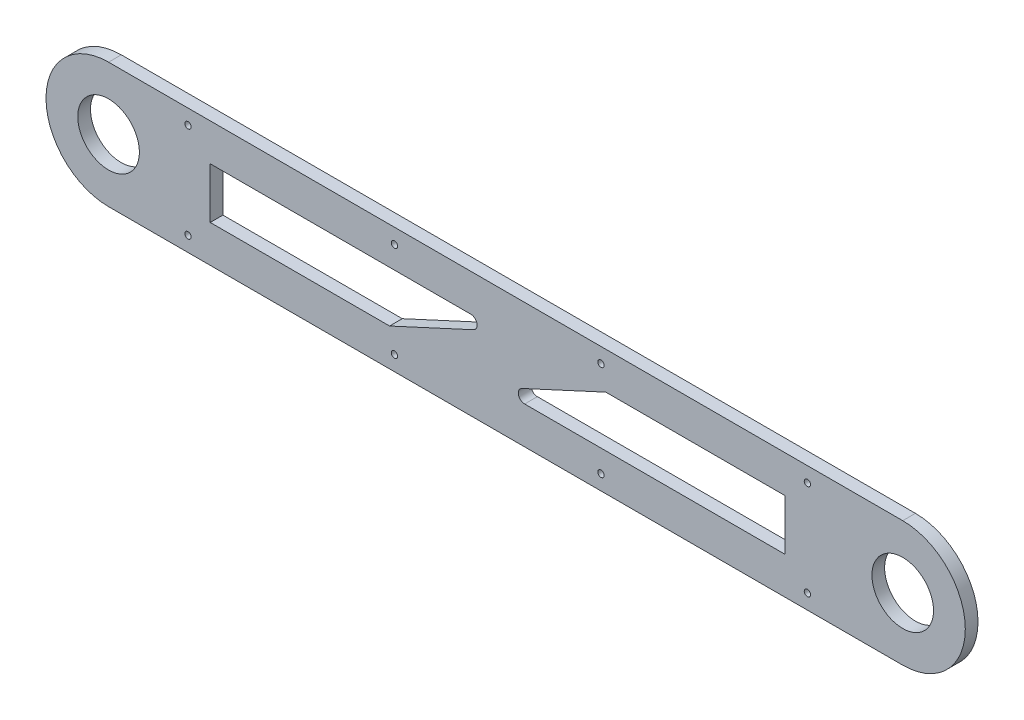
ISO-10303-21;
HEADER;
FILE_DESCRIPTION(('STEP AP214'),'2;1');
FILE_NAME('part.step','',(''),(''),'','','');
FILE_SCHEMA(('AUTOMOTIVE_DESIGN { 1 0 10303 214 1 1 1 1 }'));
ENDSEC;
DATA;
#1=APPLICATION_CONTEXT('core data for automotive mechanical design processes');
#2=APPLICATION_PROTOCOL_DEFINITION('international standard','automotive_design',2000,#1);
#3=PRODUCT_CONTEXT('',#1,'mechanical');
#4=PRODUCT('Part','Part','',(#3));
#5=PRODUCT_RELATED_PRODUCT_CATEGORY('part','',(#4));
#6=PRODUCT_DEFINITION_FORMATION('','',#4);
#7=PRODUCT_DEFINITION_CONTEXT('part definition',#1,'design');
#8=PRODUCT_DEFINITION('design','',#6,#7);
#9=PRODUCT_DEFINITION_SHAPE('','',#8);
#10=(LENGTH_UNIT() NAMED_UNIT(*) SI_UNIT(.MILLI.,.METRE.));
#11=(NAMED_UNIT(*) PLANE_ANGLE_UNIT() SI_UNIT($,.RADIAN.));
#12=(NAMED_UNIT(*) SI_UNIT($,.STERADIAN.) SOLID_ANGLE_UNIT());
#13=UNCERTAINTY_MEASURE_WITH_UNIT(LENGTH_MEASURE(1.E-05),#10,'distance_accuracy_value','');
#14=(GEOMETRIC_REPRESENTATION_CONTEXT(3) GLOBAL_UNCERTAINTY_ASSIGNED_CONTEXT((#13)) GLOBAL_UNIT_ASSIGNED_CONTEXT((#10,
#11,#12)) REPRESENTATION_CONTEXT('',''));
#15=CARTESIAN_POINT('',(0.,0.,0.));
#16=DIRECTION('',(0.,0.,1.));
#17=DIRECTION('',(1.,0.,0.));
#18=AXIS2_PLACEMENT_3D('',#15,#16,#17);
#19=CARTESIAN_POINT('',(0.,0.,4.));
#20=DIRECTION('',(0.,0.,1.));
#21=DIRECTION('',(1.,0.,0.));
#22=AXIS2_PLACEMENT_3D('',#19,#20,#21);
#23=PLANE('',#22);
#24=CARTESIAN_POINT('',(130.976731594915,-6.,4.));
#25=DIRECTION('',(0.,0.,1.));
#26=DIRECTION('',(-1.,0.,0.));
#27=AXIS2_PLACEMENT_3D('',#24,#25,#26);
#28=CIRCLE('',#27,2.);
#29=CARTESIAN_POINT('',(130.138615239991,-4.18408123099903,4.));
#30=VERTEX_POINT('',#29);
#31=CARTESIAN_POINT('',(130.976731594915,-8.,4.));
#32=VERTEX_POINT('',#31);
#33=EDGE_CURVE('E54',#30,#32,#28,.T.);
#34=ORIENTED_EDGE('',*,*,#33,.F.);
#35=DIRECTION('',(-0.907959384500451,-0.419058177461749,0.));
#36=VECTOR('',#35,1.);
#37=CARTESIAN_POINT('',(156.537457907156,8.,4.));
#38=LINE('',#37,#36);
#39=CARTESIAN_POINT('',(156.537457907156,8.,4.));
#40=VERTEX_POINT('',#39);
#41=EDGE_CURVE('E170',#40,#30,#38,.T.);
#42=ORIENTED_EDGE('',*,*,#41,.F.);
#43=DIRECTION('',(-1.,0.,0.));
#44=VECTOR('',#43,1.);
#45=CARTESIAN_POINT('',(156.537457907156,8.,4.));
#46=LINE('',#45,#44);
#47=CARTESIAN_POINT('',(213.,8.,4.));
#48=VERTEX_POINT('',#47);
#49=EDGE_CURVE('E166',#48,#40,#46,.T.);
#50=ORIENTED_EDGE('',*,*,#49,.F.);
#51=DIRECTION('',(0.,1.,0.));
#52=VECTOR('',#51,1.);
#53=CARTESIAN_POINT('',(213.,8.,4.));
#54=LINE('',#53,#52);
#55=CARTESIAN_POINT('',(213.,-8.,4.));
#56=VERTEX_POINT('',#55);
#57=EDGE_CURVE('E147',#56,#48,#54,.T.);
#58=ORIENTED_EDGE('',*,*,#57,.F.);
#59=DIRECTION('',(1.,0.,0.));
#60=VECTOR('',#59,1.);
#61=CARTESIAN_POINT('',(213.,-8.,4.));
#62=LINE('',#61,#60);
#63=EDGE_CURVE('E158',#32,#56,#62,.T.);
#64=ORIENTED_EDGE('',*,*,#63,.F.);
#65=EDGE_LOOP('',(#34,#42,#50,#58,#64));
#66=FACE_BOUND('',#65,.T.);
#67=DIRECTION('',(0.,-1.,0.));
#68=VECTOR('',#67,1.);
#69=CARTESIAN_POINT('',(32.0000000000003,-8.,4.));
#70=LINE('',#69,#68);
#71=CARTESIAN_POINT('',(32.0000000000003,8.,4.));
#72=VERTEX_POINT('',#71);
#73=CARTESIAN_POINT('',(32.0000000000003,-8.,4.));
#74=VERTEX_POINT('',#73);
#75=EDGE_CURVE('E62',#72,#74,#70,.T.);
#76=ORIENTED_EDGE('',*,*,#75,.F.);
#77=DIRECTION('',(-1.,0.,0.));
#78=VECTOR('',#77,1.);
#79=CARTESIAN_POINT('',(32.0000000000003,8.,4.));
#80=LINE('',#79,#78);
#81=CARTESIAN_POINT('',(114.023268405086,8.,4.));
#82=VERTEX_POINT('',#81);
#83=EDGE_CURVE('E202',#82,#72,#80,.T.);
#84=ORIENTED_EDGE('',*,*,#83,.F.);
#85=CARTESIAN_POINT('',(114.023268405086,6.,4.));
#86=DIRECTION('',(0.,0.,1.));
#87=DIRECTION('',(1.,0.,0.));
#88=AXIS2_PLACEMENT_3D('',#85,#86,#87);
#89=CIRCLE('',#88,2.);
#90=CARTESIAN_POINT('',(114.861384760009,4.18408123099904,4.));
#91=VERTEX_POINT('',#90);
#92=EDGE_CURVE('E198',#91,#82,#89,.T.);
#93=ORIENTED_EDGE('',*,*,#92,.F.);
#94=DIRECTION('',(0.907959384500451,0.419058177461749,0.));
#95=VECTOR('',#94,1.);
#96=CARTESIAN_POINT('',(114.861384760009,4.18408123099903,4.));
#97=LINE('',#96,#95);
#98=CARTESIAN_POINT('',(88.4625420928446,-8.,4.));
#99=VERTEX_POINT('',#98);
#100=EDGE_CURVE('E194',#99,#91,#97,.T.);
#101=ORIENTED_EDGE('',*,*,#100,.F.);
#102=DIRECTION('',(1.,0.,0.));
#103=VECTOR('',#102,1.);
#104=CARTESIAN_POINT('',(88.4625420928446,-8.,4.));
#105=LINE('',#104,#103);
#106=EDGE_CURVE('E190',#74,#99,#105,.T.);
#107=ORIENTED_EDGE('',*,*,#106,.F.);
#108=EDGE_LOOP('',(#76,#84,#93,#101,#107));
#109=FACE_BOUND('',#108,.T.);
#110=CARTESIAN_POINT('',(90.0000000000003,-15.,4.));
#111=DIRECTION('',(0.,0.,1.));
#112=DIRECTION('',(1.,0.,0.));
#113=AXIS2_PLACEMENT_3D('',#110,#111,#112);
#114=CIRCLE('',#113,0.999999999999998);
#115=CARTESIAN_POINT('',(91.0000000000003,-15.,4.));
#116=VERTEX_POINT('',#115);
#117=EDGE_CURVE('E225',#116,#116,#114,.T.);
#118=ORIENTED_EDGE('',*,*,#117,.F.);
#119=EDGE_LOOP('',(#118));
#120=FACE_BOUND('',#119,.T.);
#121=CARTESIAN_POINT('',(220.,15.,4.));
#122=DIRECTION('',(0.,0.,1.));
#123=DIRECTION('',(1.,0.,0.));
#124=AXIS2_PLACEMENT_3D('',#121,#122,#123);
#125=CIRCLE('',#124,0.999999999999998);
#126=CARTESIAN_POINT('',(221.,15.,4.));
#127=VERTEX_POINT('',#126);
#128=EDGE_CURVE('E233',#127,#127,#125,.T.);
#129=ORIENTED_EDGE('',*,*,#128,.F.);
#130=EDGE_LOOP('',(#129));
#131=FACE_BOUND('',#130,.T.);
#132=CARTESIAN_POINT('',(155.,15.,4.));
#133=DIRECTION('',(0.,0.,1.));
#134=DIRECTION('',(1.,0.,0.));
#135=AXIS2_PLACEMENT_3D('',#132,#133,#134);
#136=CIRCLE('',#135,0.999999999999998);
#137=CARTESIAN_POINT('',(156.,15.,4.));
#138=VERTEX_POINT('',#137);
#139=EDGE_CURVE('E237',#138,#138,#136,.T.);
#140=ORIENTED_EDGE('',*,*,#139,.F.);
#141=EDGE_LOOP('',(#140));
#142=FACE_BOUND('',#141,.T.);
#143=CARTESIAN_POINT('',(90.,15.,4.));
#144=DIRECTION('',(0.,0.,1.));
#145=DIRECTION('',(1.,0.,0.));
#146=AXIS2_PLACEMENT_3D('',#143,#144,#145);
#147=CIRCLE('',#146,1.00000000000001);
#148=CARTESIAN_POINT('',(91.,15.,4.));
#149=VERTEX_POINT('',#148);
#150=EDGE_CURVE('E241',#149,#149,#147,.T.);
#151=ORIENTED_EDGE('',*,*,#150,.F.);
#152=EDGE_LOOP('',(#151));
#153=FACE_BOUND('',#152,.T.);
#154=CARTESIAN_POINT('',(155.,-15.,4.));
#155=DIRECTION('',(0.,0.,1.));
#156=DIRECTION('',(1.,0.,0.));
#157=AXIS2_PLACEMENT_3D('',#154,#155,#156);
#158=CIRCLE('',#157,0.999999999999998);
#159=CARTESIAN_POINT('',(156.,-15.,4.));
#160=VERTEX_POINT('',#159);
#161=EDGE_CURVE('E221',#160,#160,#158,.T.);
#162=ORIENTED_EDGE('',*,*,#161,.F.);
#163=EDGE_LOOP('',(#162));
#164=FACE_BOUND('',#163,.T.);
#165=CARTESIAN_POINT('',(220.,-15.,4.));
#166=DIRECTION('',(0.,0.,1.));
#167=DIRECTION('',(1.,0.,0.));
#168=AXIS2_PLACEMENT_3D('',#165,#166,#167);
#169=CIRCLE('',#168,0.999999999999998);
#170=CARTESIAN_POINT('',(221.,-15.,4.));
#171=VERTEX_POINT('',#170);
#172=EDGE_CURVE('E226',#171,#171,#169,.T.);
#173=ORIENTED_EDGE('',*,*,#172,.F.);
#174=EDGE_LOOP('',(#173));
#175=FACE_BOUND('',#174,.T.);
#176=CARTESIAN_POINT('',(25.0000000000003,-15.,4.));
#177=DIRECTION('',(0.,0.,1.));
#178=DIRECTION('',(1.,0.,0.));
#179=AXIS2_PLACEMENT_3D('',#176,#177,#178);
#180=CIRCLE('',#179,1.);
#181=CARTESIAN_POINT('',(26.0000000000003,-15.,4.));
#182=VERTEX_POINT('',#181);
#183=EDGE_CURVE('E180',#182,#182,#180,.T.);
#184=ORIENTED_EDGE('',*,*,#183,.F.);
#185=EDGE_LOOP('',(#184));
#186=FACE_BOUND('',#185,.T.);
#187=CARTESIAN_POINT('',(25.,15.,4.));
#188=DIRECTION('',(0.,0.,1.));
#189=DIRECTION('',(1.,0.,0.));
#190=AXIS2_PLACEMENT_3D('',#187,#188,#189);
#191=CIRCLE('',#190,1.);
#192=CARTESIAN_POINT('',(26.,15.,4.));
#193=VERTEX_POINT('',#192);
#194=EDGE_CURVE('E245',#193,#193,#191,.T.);
#195=ORIENTED_EDGE('',*,*,#194,.F.);
#196=EDGE_LOOP('',(#195));
#197=FACE_BOUND('',#196,.T.);
#198=CARTESIAN_POINT('',(0.,0.,4.));
#199=DIRECTION('',(0.,0.,1.));
#200=DIRECTION('',(1.,0.,0.));
#201=AXIS2_PLACEMENT_3D('',#198,#199,#200);
#202=CIRCLE('',#201,9.7);
#203=CARTESIAN_POINT('',(9.7,0.,4.));
#204=VERTEX_POINT('',#203);
#205=EDGE_CURVE('E263',#204,#204,#202,.T.);
#206=ORIENTED_EDGE('',*,*,#205,.F.);
#207=EDGE_LOOP('',(#206));
#208=FACE_BOUND('',#207,.T.);
#209=CARTESIAN_POINT('',(0.,0.,4.));
#210=DIRECTION('',(0.,0.,1.));
#211=DIRECTION('',(1.,0.,0.));
#212=AXIS2_PLACEMENT_3D('',#209,#210,#211);
#213=CIRCLE('',#212,19.7);
#214=CARTESIAN_POINT('',(0.,19.7,4.));
#215=VERTEX_POINT('',#214);
#216=CARTESIAN_POINT('',(0.,-19.7,4.));
#217=VERTEX_POINT('',#216);
#218=EDGE_CURVE('E271',#215,#217,#213,.T.);
#219=ORIENTED_EDGE('',*,*,#218,.T.);
#220=DIRECTION('',(1.,0.,0.));
#221=VECTOR('',#220,1.);
#222=CARTESIAN_POINT('',(0.,-19.7,4.));
#223=LINE('',#222,#221);
#224=CARTESIAN_POINT('',(250.,-19.7,4.));
#225=VERTEX_POINT('',#224);
#226=EDGE_CURVE('E275',#217,#225,#223,.T.);
#227=ORIENTED_EDGE('',*,*,#226,.T.);
#228=CARTESIAN_POINT('',(250.,0.,4.));
#229=DIRECTION('',(0.,0.,1.));
#230=DIRECTION('',(-1.,0.,0.));
#231=AXIS2_PLACEMENT_3D('',#228,#229,#230);
#232=CIRCLE('',#231,19.7);
#233=CARTESIAN_POINT('',(250.,19.7,4.));
#234=VERTEX_POINT('',#233);
#235=EDGE_CURVE('E279',#225,#234,#232,.T.);
#236=ORIENTED_EDGE('',*,*,#235,.T.);
#237=DIRECTION('',(-1.,0.,0.));
#238=VECTOR('',#237,1.);
#239=CARTESIAN_POINT('',(0.,19.7,4.));
#240=LINE('',#239,#238);
#241=EDGE_CURVE('E282',#234,#215,#240,.T.);
#242=ORIENTED_EDGE('',*,*,#241,.T.);
#243=EDGE_LOOP('',(#219,#227,#236,#242));
#244=FACE_BOUND('',#243,.T.);
#245=CARTESIAN_POINT('',(250.,0.,4.));
#246=DIRECTION('',(0.,0.,1.));
#247=DIRECTION('',(1.,0.,0.));
#248=AXIS2_PLACEMENT_3D('',#245,#246,#247);
#249=CIRCLE('',#248,9.7);
#250=CARTESIAN_POINT('',(259.7,0.,4.));
#251=VERTEX_POINT('',#250);
#252=EDGE_CURVE('E253',#251,#251,#249,.T.);
#253=ORIENTED_EDGE('',*,*,#252,.F.);
#254=EDGE_LOOP('',(#253));
#255=FACE_BOUND('',#254,.T.);
#256=ADVANCED_FACE('F38',(#66,#109,#120,#131,#142,#153,#164,#175,#186,#197,#208,#244,#255),#23,.T.);
#257=CARTESIAN_POINT('',(0.,0.,0.));
#258=DIRECTION('',(0.,0.,1.));
#259=DIRECTION('',(1.,0.,0.));
#260=AXIS2_PLACEMENT_3D('',#257,#258,#259);
#261=PLANE('',#260);
#262=DIRECTION('',(-0.907959384500451,-0.419058177461749,0.));
#263=VECTOR('',#262,1.);
#264=CARTESIAN_POINT('',(24.4456023641837,-52.9654717890643,0.));
#265=LINE('',#264,#263);
#266=CARTESIAN_POINT('',(156.537457907156,8.,0.));
#267=VERTEX_POINT('',#266);
#268=CARTESIAN_POINT('',(130.138615239991,-4.18408123099903,0.));
#269=VERTEX_POINT('',#268);
#270=EDGE_CURVE('E47',#267,#269,#265,.T.);
#271=ORIENTED_EDGE('',*,*,#270,.T.);
#272=CARTESIAN_POINT('',(130.976731594915,-6.,0.));
#273=DIRECTION('',(0.,0.,1.));
#274=DIRECTION('',(1.,0.,0.));
#275=AXIS2_PLACEMENT_3D('',#272,#273,#274);
#276=CIRCLE('',#275,2.);
#277=CARTESIAN_POINT('',(130.976731594915,-8.,0.));
#278=VERTEX_POINT('',#277);
#279=EDGE_CURVE('E11',#269,#278,#276,.T.);
#280=ORIENTED_EDGE('',*,*,#279,.T.);
#281=DIRECTION('',(1.,0.,0.));
#282=VECTOR('',#281,1.);
#283=CARTESIAN_POINT('',(0.,-8.,0.));
#284=LINE('',#283,#282);
#285=CARTESIAN_POINT('',(213.,-8.,0.));
#286=VERTEX_POINT('',#285);
#287=EDGE_CURVE('E362',#278,#286,#284,.T.);
#288=ORIENTED_EDGE('',*,*,#287,.T.);
#289=DIRECTION('',(0.,1.,0.));
#290=VECTOR('',#289,1.);
#291=CARTESIAN_POINT('',(213.,0.,0.));
#292=LINE('',#291,#290);
#293=CARTESIAN_POINT('',(213.,8.,0.));
#294=VERTEX_POINT('',#293);
#295=EDGE_CURVE('E150',#286,#294,#292,.T.);
#296=ORIENTED_EDGE('',*,*,#295,.T.);
#297=DIRECTION('',(-1.,0.,0.));
#298=VECTOR('',#297,1.);
#299=CARTESIAN_POINT('',(0.,8.,0.));
#300=LINE('',#299,#298);
#301=EDGE_CURVE('E367',#294,#267,#300,.T.);
#302=ORIENTED_EDGE('',*,*,#301,.T.);
#303=EDGE_LOOP('',(#271,#280,#288,#296,#302));
#304=FACE_BOUND('',#303,.T.);
#305=DIRECTION('',(-1.,0.,0.));
#306=VECTOR('',#305,1.);
#307=CARTESIAN_POINT('',(0.,8.,0.));
#308=LINE('',#307,#306);
#309=CARTESIAN_POINT('',(114.023268405086,8.,0.));
#310=VERTEX_POINT('',#309);
#311=CARTESIAN_POINT('',(32.0000000000003,8.,0.));
#312=VERTEX_POINT('',#311);
#313=EDGE_CURVE('E354',#310,#312,#308,.T.);
#314=ORIENTED_EDGE('',*,*,#313,.T.);
#315=DIRECTION('',(0.,-1.,0.));
#316=VECTOR('',#315,1.);
#317=CARTESIAN_POINT('',(32.0000000000003,0.,0.));
#318=LINE('',#317,#316);
#319=CARTESIAN_POINT('',(32.0000000000003,-8.,0.));
#320=VERTEX_POINT('',#319);
#321=EDGE_CURVE('E358',#312,#320,#318,.T.);
#322=ORIENTED_EDGE('',*,*,#321,.T.);
#323=DIRECTION('',(1.,0.,0.));
#324=VECTOR('',#323,1.);
#325=CARTESIAN_POINT('',(0.,-8.,0.));
#326=LINE('',#325,#324);
#327=CARTESIAN_POINT('',(88.4625420928446,-8.,0.));
#328=VERTEX_POINT('',#327);
#329=EDGE_CURVE('E312',#320,#328,#326,.T.);
#330=ORIENTED_EDGE('',*,*,#329,.T.);
#331=DIRECTION('',(0.907959384500451,0.419058177461749,0.));
#332=VECTOR('',#331,1.);
#333=CARTESIAN_POINT('',(18.5787878797192,-40.254040406058,0.));
#334=LINE('',#333,#332);
#335=CARTESIAN_POINT('',(114.861384760009,4.18408123099904,0.));
#336=VERTEX_POINT('',#335);
#337=EDGE_CURVE('E346',#328,#336,#334,.T.);
#338=ORIENTED_EDGE('',*,*,#337,.T.);
#339=CARTESIAN_POINT('',(114.023268405086,6.,0.));
#340=DIRECTION('',(0.,0.,1.));
#341=DIRECTION('',(1.,0.,0.));
#342=AXIS2_PLACEMENT_3D('',#339,#340,#341);
#343=CIRCLE('',#342,2.);
#344=EDGE_CURVE('E350',#336,#310,#343,.T.);
#345=ORIENTED_EDGE('',*,*,#344,.T.);
#346=EDGE_LOOP('',(#314,#322,#330,#338,#345));
#347=FACE_BOUND('',#346,.T.);
#348=CARTESIAN_POINT('',(90.0000000000003,-15.,0.));
#349=DIRECTION('',(0.,0.,1.));
#350=DIRECTION('',(1.,0.,0.));
#351=AXIS2_PLACEMENT_3D('',#348,#349,#350);
#352=CIRCLE('',#351,0.999999999999998);
#353=CARTESIAN_POINT('',(91.0000000000003,-15.,0.));
#354=VERTEX_POINT('',#353);
#355=EDGE_CURVE('E262',#354,#354,#352,.T.);
#356=ORIENTED_EDGE('',*,*,#355,.T.);
#357=EDGE_LOOP('',(#356));
#358=FACE_BOUND('',#357,.T.);
#359=CARTESIAN_POINT('',(220.,15.,0.));
#360=DIRECTION('',(0.,0.,1.));
#361=DIRECTION('',(1.,0.,0.));
#362=AXIS2_PLACEMENT_3D('',#359,#360,#361);
#363=CIRCLE('',#362,0.999999999999998);
#364=CARTESIAN_POINT('',(221.,15.,0.));
#365=VERTEX_POINT('',#364);
#366=EDGE_CURVE('E336',#365,#365,#363,.T.);
#367=ORIENTED_EDGE('',*,*,#366,.T.);
#368=EDGE_LOOP('',(#367));
#369=FACE_BOUND('',#368,.T.);
#370=CARTESIAN_POINT('',(155.,15.,0.));
#371=DIRECTION('',(0.,0.,1.));
#372=DIRECTION('',(1.,0.,0.));
#373=AXIS2_PLACEMENT_3D('',#370,#371,#372);
#374=CIRCLE('',#373,0.999999999999998);
#375=CARTESIAN_POINT('',(156.,15.,0.));
#376=VERTEX_POINT('',#375);
#377=EDGE_CURVE('E332',#376,#376,#374,.T.);
#378=ORIENTED_EDGE('',*,*,#377,.T.);
#379=EDGE_LOOP('',(#378));
#380=FACE_BOUND('',#379,.T.);
#381=CARTESIAN_POINT('',(90.,15.,0.));
#382=DIRECTION('',(0.,0.,1.));
#383=DIRECTION('',(1.,0.,0.));
#384=AXIS2_PLACEMENT_3D('',#381,#382,#383);
#385=CIRCLE('',#384,1.00000000000001);
#386=CARTESIAN_POINT('',(91.,15.,0.));
#387=VERTEX_POINT('',#386);
#388=EDGE_CURVE('E328',#387,#387,#385,.T.);
#389=ORIENTED_EDGE('',*,*,#388,.T.);
#390=EDGE_LOOP('',(#389));
#391=FACE_BOUND('',#390,.T.);
#392=CARTESIAN_POINT('',(155.,-15.,0.));
#393=DIRECTION('',(0.,0.,1.));
#394=DIRECTION('',(1.,0.,0.));
#395=AXIS2_PLACEMENT_3D('',#392,#393,#394);
#396=CIRCLE('',#395,0.999999999999998);
#397=CARTESIAN_POINT('',(156.,-15.,0.));
#398=VERTEX_POINT('',#397);
#399=EDGE_CURVE('E324',#398,#398,#396,.T.);
#400=ORIENTED_EDGE('',*,*,#399,.T.);
#401=EDGE_LOOP('',(#400));
#402=FACE_BOUND('',#401,.T.);
#403=CARTESIAN_POINT('',(220.,-15.,0.));
#404=DIRECTION('',(0.,0.,1.));
#405=DIRECTION('',(1.,0.,0.));
#406=AXIS2_PLACEMENT_3D('',#403,#404,#405);
#407=CIRCLE('',#406,0.999999999999998);
#408=CARTESIAN_POINT('',(221.,-15.,0.));
#409=VERTEX_POINT('',#408);
#410=EDGE_CURVE('E320',#409,#409,#407,.T.);
#411=ORIENTED_EDGE('',*,*,#410,.T.);
#412=EDGE_LOOP('',(#411));
#413=FACE_BOUND('',#412,.T.);
#414=CARTESIAN_POINT('',(25.0000000000003,-15.,0.));
#415=DIRECTION('',(0.,0.,1.));
#416=DIRECTION('',(1.,0.,0.));
#417=AXIS2_PLACEMENT_3D('',#414,#415,#416);
#418=CIRCLE('',#417,1.);
#419=CARTESIAN_POINT('',(26.0000000000003,-15.,0.));
#420=VERTEX_POINT('',#419);
#421=EDGE_CURVE('E316',#420,#420,#418,.T.);
#422=ORIENTED_EDGE('',*,*,#421,.T.);
#423=EDGE_LOOP('',(#422));
#424=FACE_BOUND('',#423,.T.);
#425=CARTESIAN_POINT('',(25.,15.,0.));
#426=DIRECTION('',(0.,0.,1.));
#427=DIRECTION('',(1.,0.,0.));
#428=AXIS2_PLACEMENT_3D('',#425,#426,#427);
#429=CIRCLE('',#428,1.);
#430=CARTESIAN_POINT('',(26.,15.,0.));
#431=VERTEX_POINT('',#430);
#432=EDGE_CURVE('E252',#431,#431,#429,.T.);
#433=ORIENTED_EDGE('',*,*,#432,.T.);
#434=EDGE_LOOP('',(#433));
#435=FACE_BOUND('',#434,.T.);
#436=CARTESIAN_POINT('',(0.,0.,0.));
#437=DIRECTION('',(0.,0.,1.));
#438=DIRECTION('',(1.,0.,0.));
#439=AXIS2_PLACEMENT_3D('',#436,#437,#438);
#440=CIRCLE('',#439,19.7);
#441=CARTESIAN_POINT('',(0.,19.7,0.));
#442=VERTEX_POINT('',#441);
#443=CARTESIAN_POINT('',(0.,-19.7,0.));
#444=VERTEX_POINT('',#443);
#445=EDGE_CURVE('E267',#442,#444,#440,.T.);
#446=ORIENTED_EDGE('',*,*,#445,.F.);
#447=DIRECTION('',(-1.,0.,0.));
#448=VECTOR('',#447,1.);
#449=CARTESIAN_POINT('',(0.,19.7,0.));
#450=LINE('',#449,#448);
#451=CARTESIAN_POINT('',(250.,19.7,0.));
#452=VERTEX_POINT('',#451);
#453=EDGE_CURVE('E276',#452,#442,#450,.T.);
#454=ORIENTED_EDGE('',*,*,#453,.F.);
#455=CARTESIAN_POINT('',(250.,0.,0.));
#456=DIRECTION('',(0.,0.,1.));
#457=DIRECTION('',(-1.,0.,0.));
#458=AXIS2_PLACEMENT_3D('',#455,#456,#457);
#459=CIRCLE('',#458,19.7);
#460=CARTESIAN_POINT('',(250.,-19.7,0.));
#461=VERTEX_POINT('',#460);
#462=EDGE_CURVE('E292',#461,#452,#459,.T.);
#463=ORIENTED_EDGE('',*,*,#462,.F.);
#464=DIRECTION('',(1.,0.,0.));
#465=VECTOR('',#464,1.);
#466=CARTESIAN_POINT('',(0.,-19.7,0.));
#467=LINE('',#466,#465);
#468=EDGE_CURVE('E289',#444,#461,#467,.T.);
#469=ORIENTED_EDGE('',*,*,#468,.F.);
#470=EDGE_LOOP('',(#446,#454,#463,#469));
#471=FACE_BOUND('',#470,.T.);
#472=CARTESIAN_POINT('',(0.,0.,0.));
#473=DIRECTION('',(0.,0.,1.));
#474=DIRECTION('',(1.,0.,0.));
#475=AXIS2_PLACEMENT_3D('',#472,#473,#474);
#476=CIRCLE('',#475,9.7);
#477=CARTESIAN_POINT('',(9.7,0.,0.));
#478=VERTEX_POINT('',#477);
#479=EDGE_CURVE('E257',#478,#478,#476,.T.);
#480=ORIENTED_EDGE('',*,*,#479,.T.);
#481=EDGE_LOOP('',(#480));
#482=FACE_BOUND('',#481,.T.);
#483=CARTESIAN_POINT('',(250.,0.,0.));
#484=DIRECTION('',(0.,0.,1.));
#485=DIRECTION('',(1.,0.,0.));
#486=AXIS2_PLACEMENT_3D('',#483,#484,#485);
#487=CIRCLE('',#486,9.7);
#488=CARTESIAN_POINT('',(259.7,0.,0.));
#489=VERTEX_POINT('',#488);
#490=EDGE_CURVE('E258',#489,#489,#487,.T.);
#491=ORIENTED_EDGE('',*,*,#490,.T.);
#492=EDGE_LOOP('',(#491));
#493=FACE_BOUND('',#492,.T.);
#494=ADVANCED_FACE('F373',(#304,#347,#358,#369,#380,#391,#402,#413,#424,#435,#471,#482,#493),
#261,.F.);
#495=CARTESIAN_POINT('',(0.,0.,4.));
#496=DIRECTION('',(0.,0.,-1.));
#497=DIRECTION('',(-1.,0.,0.));
#498=AXIS2_PLACEMENT_3D('',#495,#496,#497);
#499=CYLINDRICAL_SURFACE('',#498,19.7);
#500=ORIENTED_EDGE('',*,*,#445,.T.);
#501=DIRECTION('',(0.,0.,-1.));
#502=VECTOR('',#501,1.);
#503=CARTESIAN_POINT('',(0.,-19.7,4.));
#504=LINE('',#503,#502);
#505=EDGE_CURVE('E308',#217,#444,#504,.T.);
#506=ORIENTED_EDGE('',*,*,#505,.F.);
#507=ORIENTED_EDGE('',*,*,#218,.F.);
#508=DIRECTION('',(0.,0.,-1.));
#509=VECTOR('',#508,1.);
#510=CARTESIAN_POINT('',(0.,19.7,4.));
#511=LINE('',#510,#509);
#512=EDGE_CURVE('E285',#215,#442,#511,.T.);
#513=ORIENTED_EDGE('',*,*,#512,.T.);
#514=EDGE_LOOP('',(#500,#506,#507,#513));
#515=FACE_BOUND('',#514,.T.);
#516=ADVANCED_FACE('F40',(#515),#499,.T.);
#517=CARTESIAN_POINT('',(0.,-19.7,4.));
#518=DIRECTION('',(0.,1.,0.));
#519=DIRECTION('',(-1.,0.,0.));
#520=AXIS2_PLACEMENT_3D('',#517,#518,#519);
#521=PLANE('',#520);
#522=ORIENTED_EDGE('',*,*,#468,.T.);
#523=DIRECTION('',(0.,0.,-1.));
#524=VECTOR('',#523,1.);
#525=CARTESIAN_POINT('',(250.,-19.7,4.));
#526=LINE('',#525,#524);
#527=EDGE_CURVE('E304',#225,#461,#526,.T.);
#528=ORIENTED_EDGE('',*,*,#527,.F.);
#529=ORIENTED_EDGE('',*,*,#226,.F.);
#530=ORIENTED_EDGE('',*,*,#505,.T.);
#531=EDGE_LOOP('',(#522,#528,#529,#530));
#532=FACE_BOUND('',#531,.T.);
#533=ADVANCED_FACE('F413',(#532),#521,.F.);
#534=CARTESIAN_POINT('',(250.,0.,4.));
#535=DIRECTION('',(0.,0.,-1.));
#536=DIRECTION('',(-1.,0.,0.));
#537=AXIS2_PLACEMENT_3D('',#534,#535,#536);
#538=CYLINDRICAL_SURFACE('',#537,19.7);
#539=ORIENTED_EDGE('',*,*,#462,.T.);
#540=DIRECTION('',(0.,0.,-1.));
#541=VECTOR('',#540,1.);
#542=CARTESIAN_POINT('',(250.,19.7,4.));
#543=LINE('',#542,#541);
#544=EDGE_CURVE('E300',#234,#452,#543,.T.);
#545=ORIENTED_EDGE('',*,*,#544,.F.);
#546=ORIENTED_EDGE('',*,*,#235,.F.);
#547=ORIENTED_EDGE('',*,*,#527,.T.);
#548=EDGE_LOOP('',(#539,#545,#546,#547));
#549=FACE_BOUND('',#548,.T.);
#550=ADVANCED_FACE('F410',(#549),#538,.T.);
#551=CARTESIAN_POINT('',(0.,19.7,4.));
#552=DIRECTION('',(0.,-1.,0.));
#553=DIRECTION('',(1.,0.,0.));
#554=AXIS2_PLACEMENT_3D('',#551,#552,#553);
#555=PLANE('',#554);
#556=ORIENTED_EDGE('',*,*,#453,.T.);
#557=ORIENTED_EDGE('',*,*,#512,.F.);
#558=ORIENTED_EDGE('',*,*,#241,.F.);
#559=ORIENTED_EDGE('',*,*,#544,.T.);
#560=EDGE_LOOP('',(#556,#557,#558,#559));
#561=FACE_BOUND('',#560,.T.);
#562=ADVANCED_FACE('F407',(#561),#555,.F.);
#563=CARTESIAN_POINT('',(0.,0.,4.));
#564=DIRECTION('',(0.,0.,-1.));
#565=DIRECTION('',(-1.,0.,0.));
#566=AXIS2_PLACEMENT_3D('',#563,#564,#565);
#567=CYLINDRICAL_SURFACE('',#566,9.7);
#568=ORIENTED_EDGE('',*,*,#205,.T.);
#569=EDGE_LOOP('',(#568));
#570=FACE_BOUND('',#569,.T.);
#571=ORIENTED_EDGE('',*,*,#479,.F.);
#572=EDGE_LOOP('',(#571));
#573=FACE_BOUND('',#572,.T.);
#574=ADVANCED_FACE('F404',(#570,#573),#567,.F.);
#575=CARTESIAN_POINT('',(250.,0.,4.));
#576=DIRECTION('',(0.,0.,-1.));
#577=DIRECTION('',(-1.,0.,0.));
#578=AXIS2_PLACEMENT_3D('',#575,#576,#577);
#579=CYLINDRICAL_SURFACE('',#578,9.7);
#580=ORIENTED_EDGE('',*,*,#252,.T.);
#581=EDGE_LOOP('',(#580));
#582=FACE_BOUND('',#581,.T.);
#583=ORIENTED_EDGE('',*,*,#490,.F.);
#584=EDGE_LOOP('',(#583));
#585=FACE_BOUND('',#584,.T.);
#586=ADVANCED_FACE('F437',(#582,#585),#579,.F.);
#587=CARTESIAN_POINT('',(25.,15.,-6.));
#588=DIRECTION('',(0.,0.,1.));
#589=DIRECTION('',(1.,0.,0.));
#590=AXIS2_PLACEMENT_3D('',#587,#588,#589);
#591=CYLINDRICAL_SURFACE('',#590,1.);
#592=ORIENTED_EDGE('',*,*,#194,.T.);
#593=EDGE_LOOP('',(#592));
#594=FACE_BOUND('',#593,.T.);
#595=ORIENTED_EDGE('',*,*,#432,.F.);
#596=EDGE_LOOP('',(#595));
#597=FACE_BOUND('',#596,.T.);
#598=ADVANCED_FACE('F440',(#594,#597),#591,.F.);
#599=CARTESIAN_POINT('',(25.0000000000003,-15.,-6.));
#600=DIRECTION('',(0.,0.,1.));
#601=DIRECTION('',(1.,0.,0.));
#602=AXIS2_PLACEMENT_3D('',#599,#600,#601);
#603=CYLINDRICAL_SURFACE('',#602,1.);
#604=ORIENTED_EDGE('',*,*,#183,.T.);
#605=EDGE_LOOP('',(#604));
#606=FACE_BOUND('',#605,.T.);
#607=ORIENTED_EDGE('',*,*,#421,.F.);
#608=EDGE_LOOP('',(#607));
#609=FACE_BOUND('',#608,.T.);
#610=ADVANCED_FACE('F447',(#606,#609),#603,.F.);
#611=CARTESIAN_POINT('',(220.,-15.,-6.));
#612=DIRECTION('',(0.,0.,1.));
#613=DIRECTION('',(1.,0.,0.));
#614=AXIS2_PLACEMENT_3D('',#611,#612,#613);
#615=CYLINDRICAL_SURFACE('',#614,0.999999999999998);
#616=ORIENTED_EDGE('',*,*,#172,.T.);
#617=EDGE_LOOP('',(#616));
#618=FACE_BOUND('',#617,.T.);
#619=ORIENTED_EDGE('',*,*,#410,.F.);
#620=EDGE_LOOP('',(#619));
#621=FACE_BOUND('',#620,.T.);
#622=ADVANCED_FACE('F472',(#618,#621),#615,.F.);
#623=CARTESIAN_POINT('',(155.,-15.,-6.));
#624=DIRECTION('',(0.,0.,1.));
#625=DIRECTION('',(1.,0.,0.));
#626=AXIS2_PLACEMENT_3D('',#623,#624,#625);
#627=CYLINDRICAL_SURFACE('',#626,0.999999999999998);
#628=ORIENTED_EDGE('',*,*,#161,.T.);
#629=EDGE_LOOP('',(#628));
#630=FACE_BOUND('',#629,.T.);
#631=ORIENTED_EDGE('',*,*,#399,.F.);
#632=EDGE_LOOP('',(#631));
#633=FACE_BOUND('',#632,.T.);
#634=ADVANCED_FACE('F460',(#630,#633),#627,.F.);
#635=CARTESIAN_POINT('',(90.,15.,-6.));
#636=DIRECTION('',(0.,0.,1.));
#637=DIRECTION('',(1.,0.,0.));
#638=AXIS2_PLACEMENT_3D('',#635,#636,#637);
#639=CYLINDRICAL_SURFACE('',#638,1.00000000000001);
#640=ORIENTED_EDGE('',*,*,#150,.T.);
#641=EDGE_LOOP('',(#640));
#642=FACE_BOUND('',#641,.T.);
#643=ORIENTED_EDGE('',*,*,#388,.F.);
#644=EDGE_LOOP('',(#643));
#645=FACE_BOUND('',#644,.T.);
#646=ADVANCED_FACE('F456',(#642,#645),#639,.F.);
#647=CARTESIAN_POINT('',(155.,15.,-6.));
#648=DIRECTION('',(0.,0.,1.));
#649=DIRECTION('',(1.,0.,0.));
#650=AXIS2_PLACEMENT_3D('',#647,#648,#649);
#651=CYLINDRICAL_SURFACE('',#650,0.999999999999998);
#652=ORIENTED_EDGE('',*,*,#139,.T.);
#653=EDGE_LOOP('',(#652));
#654=FACE_BOUND('',#653,.T.);
#655=ORIENTED_EDGE('',*,*,#377,.F.);
#656=EDGE_LOOP('',(#655));
#657=FACE_BOUND('',#656,.T.);
#658=ADVANCED_FACE('F452',(#654,#657),#651,.F.);
#659=CARTESIAN_POINT('',(220.,15.,-6.));
#660=DIRECTION('',(0.,0.,1.));
#661=DIRECTION('',(1.,0.,0.));
#662=AXIS2_PLACEMENT_3D('',#659,#660,#661);
#663=CYLINDRICAL_SURFACE('',#662,0.999999999999998);
#664=ORIENTED_EDGE('',*,*,#128,.T.);
#665=EDGE_LOOP('',(#664));
#666=FACE_BOUND('',#665,.T.);
#667=ORIENTED_EDGE('',*,*,#366,.F.);
#668=EDGE_LOOP('',(#667));
#669=FACE_BOUND('',#668,.T.);
#670=ADVANCED_FACE('F455',(#666,#669),#663,.F.);
#671=CARTESIAN_POINT('',(90.0000000000003,-15.,-6.));
#672=DIRECTION('',(0.,0.,1.));
#673=DIRECTION('',(1.,0.,0.));
#674=AXIS2_PLACEMENT_3D('',#671,#672,#673);
#675=CYLINDRICAL_SURFACE('',#674,0.999999999999998);
#676=ORIENTED_EDGE('',*,*,#117,.T.);
#677=EDGE_LOOP('',(#676));
#678=FACE_BOUND('',#677,.T.);
#679=ORIENTED_EDGE('',*,*,#355,.F.);
#680=EDGE_LOOP('',(#679));
#681=FACE_BOUND('',#680,.T.);
#682=ADVANCED_FACE('F462',(#678,#681),#675,.F.);
#683=CARTESIAN_POINT('',(32.0000000000003,-8.,-6.));
#684=DIRECTION('',(-1.,0.,0.));
#685=DIRECTION('',(0.,0.,1.));
#686=AXIS2_PLACEMENT_3D('',#683,#684,#685);
#687=PLANE('',#686);
#688=DIRECTION('',(0.,0.,1.));
#689=VECTOR('',#688,1.);
#690=CARTESIAN_POINT('',(32.0000000000003,8.,-6.));
#691=LINE('',#690,#689);
#692=EDGE_CURVE('E207',#312,#72,#691,.T.);
#693=ORIENTED_EDGE('',*,*,#692,.T.);
#694=ORIENTED_EDGE('',*,*,#75,.T.);
#695=DIRECTION('',(0.,0.,1.));
#696=VECTOR('',#695,1.);
#697=CARTESIAN_POINT('',(32.0000000000003,-8.,-6.));
#698=LINE('',#697,#696);
#699=EDGE_CURVE('E206',#320,#74,#698,.T.);
#700=ORIENTED_EDGE('',*,*,#699,.F.);
#701=ORIENTED_EDGE('',*,*,#321,.F.);
#702=EDGE_LOOP('',(#693,#694,#700,#701));
#703=FACE_BOUND('',#702,.T.);
#704=ADVANCED_FACE('F465',(#703),#687,.F.);
#705=CARTESIAN_POINT('',(32.0000000000003,8.,-6.));
#706=DIRECTION('',(0.,1.,0.));
#707=DIRECTION('',(0.,0.,1.));
#708=AXIS2_PLACEMENT_3D('',#705,#706,#707);
#709=PLANE('',#708);
#710=DIRECTION('',(0.,0.,1.));
#711=VECTOR('',#710,1.);
#712=CARTESIAN_POINT('',(114.023268405086,8.,-6.));
#713=LINE('',#712,#711);
#714=EDGE_CURVE('E210',#310,#82,#713,.T.);
#715=ORIENTED_EDGE('',*,*,#714,.T.);
#716=ORIENTED_EDGE('',*,*,#83,.T.);
#717=ORIENTED_EDGE('',*,*,#692,.F.);
#718=ORIENTED_EDGE('',*,*,#313,.F.);
#719=EDGE_LOOP('',(#715,#716,#717,#718));
#720=FACE_BOUND('',#719,.T.);
#721=ADVANCED_FACE('F481',(#720),#709,.F.);
#722=CARTESIAN_POINT('',(114.023268405086,6.,-6.));
#723=DIRECTION('',(0.,0.,1.));
#724=DIRECTION('',(1.,0.,0.));
#725=AXIS2_PLACEMENT_3D('',#722,#723,#724);
#726=CYLINDRICAL_SURFACE('',#725,2.);
#727=DIRECTION('',(0.,0.,1.));
#728=VECTOR('',#727,1.);
#729=CARTESIAN_POINT('',(114.861384760009,4.18408123099904,-6.));
#730=LINE('',#729,#728);
#731=EDGE_CURVE('E213',#336,#91,#730,.T.);
#732=ORIENTED_EDGE('',*,*,#731,.T.);
#733=ORIENTED_EDGE('',*,*,#92,.T.);
#734=ORIENTED_EDGE('',*,*,#714,.F.);
#735=ORIENTED_EDGE('',*,*,#344,.F.);
#736=EDGE_LOOP('',(#732,#733,#734,#735));
#737=FACE_BOUND('',#736,.T.);
#738=ADVANCED_FACE('F485',(#737),#726,.F.);
#739=CARTESIAN_POINT('',(114.861384760009,4.18408123099903,-6.));
#740=DIRECTION('',(0.419058177461749,-0.907959384500451,0.));
#741=DIRECTION('',(0.907959384500451,0.419058177461749,0.));
#742=AXIS2_PLACEMENT_3D('',#739,#740,#741);
#743=PLANE('',#742);
#744=DIRECTION('',(0.,0.,1.));
#745=VECTOR('',#744,1.);
#746=CARTESIAN_POINT('',(88.4625420928446,-8.,-6.));
#747=LINE('',#746,#745);
#748=EDGE_CURVE('E216',#328,#99,#747,.T.);
#749=ORIENTED_EDGE('',*,*,#748,.T.);
#750=ORIENTED_EDGE('',*,*,#100,.T.);
#751=ORIENTED_EDGE('',*,*,#731,.F.);
#752=ORIENTED_EDGE('',*,*,#337,.F.);
#753=EDGE_LOOP('',(#749,#750,#751,#752));
#754=FACE_BOUND('',#753,.T.);
#755=ADVANCED_FACE('F391',(#754),#743,.F.);
#756=CARTESIAN_POINT('',(88.4625420928446,-8.,-6.));
#757=DIRECTION('',(0.,-1.,0.));
#758=DIRECTION('',(0.,0.,-1.));
#759=AXIS2_PLACEMENT_3D('',#756,#757,#758);
#760=PLANE('',#759);
#761=ORIENTED_EDGE('',*,*,#699,.T.);
#762=ORIENTED_EDGE('',*,*,#106,.T.);
#763=ORIENTED_EDGE('',*,*,#748,.F.);
#764=ORIENTED_EDGE('',*,*,#329,.F.);
#765=EDGE_LOOP('',(#761,#762,#763,#764));
#766=FACE_BOUND('',#765,.T.);
#767=ADVANCED_FACE('F384',(#766),#760,.F.);
#768=CARTESIAN_POINT('',(130.976731594915,-6.,-6.));
#769=DIRECTION('',(0.,0.,1.));
#770=DIRECTION('',(1.,0.,0.));
#771=AXIS2_PLACEMENT_3D('',#768,#769,#770);
#772=CYLINDRICAL_SURFACE('',#771,2.);
#773=DIRECTION('',(0.,0.,1.));
#774=VECTOR('',#773,1.);
#775=CARTESIAN_POINT('',(130.138615239991,-4.18408123099903,-6.));
#776=LINE('',#775,#774);
#777=EDGE_CURVE('E177',#269,#30,#776,.T.);
#778=ORIENTED_EDGE('',*,*,#777,.T.);
#779=ORIENTED_EDGE('',*,*,#33,.T.);
#780=DIRECTION('',(0.,0.,1.));
#781=VECTOR('',#780,1.);
#782=CARTESIAN_POINT('',(130.976731594915,-8.,-6.));
#783=LINE('',#782,#781);
#784=EDGE_CURVE('E155',#278,#32,#783,.T.);
#785=ORIENTED_EDGE('',*,*,#784,.F.);
#786=ORIENTED_EDGE('',*,*,#279,.F.);
#787=EDGE_LOOP('',(#778,#779,#785,#786));
#788=FACE_BOUND('',#787,.T.);
#789=ADVANCED_FACE('F382',(#788),#772,.F.);
#790=CARTESIAN_POINT('',(156.537457907156,8.,-6.));
#791=DIRECTION('',(-0.419058177461749,0.907959384500451,0.));
#792=DIRECTION('',(-0.907959384500451,-0.419058177461749,0.));
#793=AXIS2_PLACEMENT_3D('',#790,#791,#792);
#794=PLANE('',#793);
#795=DIRECTION('',(0.,0.,1.));
#796=VECTOR('',#795,1.);
#797=CARTESIAN_POINT('',(156.537457907156,8.,-6.));
#798=LINE('',#797,#796);
#799=EDGE_CURVE('E181',#267,#40,#798,.T.);
#800=ORIENTED_EDGE('',*,*,#799,.T.);
#801=ORIENTED_EDGE('',*,*,#41,.T.);
#802=ORIENTED_EDGE('',*,*,#777,.F.);
#803=ORIENTED_EDGE('',*,*,#270,.F.);
#804=EDGE_LOOP('',(#800,#801,#802,#803));
#805=FACE_BOUND('',#804,.T.);
#806=ADVANCED_FACE('F378',(#805),#794,.F.);
#807=CARTESIAN_POINT('',(156.537457907156,8.,-6.));
#808=DIRECTION('',(0.,1.,0.));
#809=DIRECTION('',(0.,0.,1.));
#810=AXIS2_PLACEMENT_3D('',#807,#808,#809);
#811=PLANE('',#810);
#812=DIRECTION('',(0.,0.,1.));
#813=VECTOR('',#812,1.);
#814=CARTESIAN_POINT('',(213.,8.,-6.));
#815=LINE('',#814,#813);
#816=EDGE_CURVE('E154',#294,#48,#815,.T.);
#817=ORIENTED_EDGE('',*,*,#816,.T.);
#818=ORIENTED_EDGE('',*,*,#49,.T.);
#819=ORIENTED_EDGE('',*,*,#799,.F.);
#820=ORIENTED_EDGE('',*,*,#301,.F.);
#821=EDGE_LOOP('',(#817,#818,#819,#820));
#822=FACE_BOUND('',#821,.T.);
#823=ADVANCED_FACE('F380',(#822),#811,.F.);
#824=CARTESIAN_POINT('',(213.,8.,-6.));
#825=DIRECTION('',(1.,0.,0.));
#826=DIRECTION('',(0.,0.,-1.));
#827=AXIS2_PLACEMENT_3D('',#824,#825,#826);
#828=PLANE('',#827);
#829=DIRECTION('',(0.,0.,1.));
#830=VECTOR('',#829,1.);
#831=CARTESIAN_POINT('',(213.,-8.,-6.));
#832=LINE('',#831,#830);
#833=EDGE_CURVE('E142',#286,#56,#832,.T.);
#834=ORIENTED_EDGE('',*,*,#833,.T.);
#835=ORIENTED_EDGE('',*,*,#57,.T.);
#836=ORIENTED_EDGE('',*,*,#816,.F.);
#837=ORIENTED_EDGE('',*,*,#295,.F.);
#838=EDGE_LOOP('',(#834,#835,#836,#837));
#839=FACE_BOUND('',#838,.T.);
#840=ADVANCED_FACE('F144',(#839),#828,.F.);
#841=CARTESIAN_POINT('',(213.,-8.,-6.));
#842=DIRECTION('',(0.,-1.,0.));
#843=DIRECTION('',(0.,0.,-1.));
#844=AXIS2_PLACEMENT_3D('',#841,#842,#843);
#845=PLANE('',#844);
#846=ORIENTED_EDGE('',*,*,#784,.T.);
#847=ORIENTED_EDGE('',*,*,#63,.T.);
#848=ORIENTED_EDGE('',*,*,#833,.F.);
#849=ORIENTED_EDGE('',*,*,#287,.F.);
#850=EDGE_LOOP('',(#846,#847,#848,#849));
#851=FACE_BOUND('',#850,.T.);
#852=ADVANCED_FACE('F159',(#851),#845,.F.);
#853=CLOSED_SHELL('',(#256,#494,#516,#533,#550,#562,#574,#586,#598,#610,#622,#634,#646,#658,
#670,#682,#704,#721,#738,#755,#767,#789,#806,#823,#840,#852));
#854=MANIFOLD_SOLID_BREP('B2',#853);
#855=ADVANCED_BREP_SHAPE_REPRESENTATION('',(#18,#854),#14);
#856=SHAPE_DEFINITION_REPRESENTATION(#9,#855);
ENDSEC;
END-ISO-10303-21;
